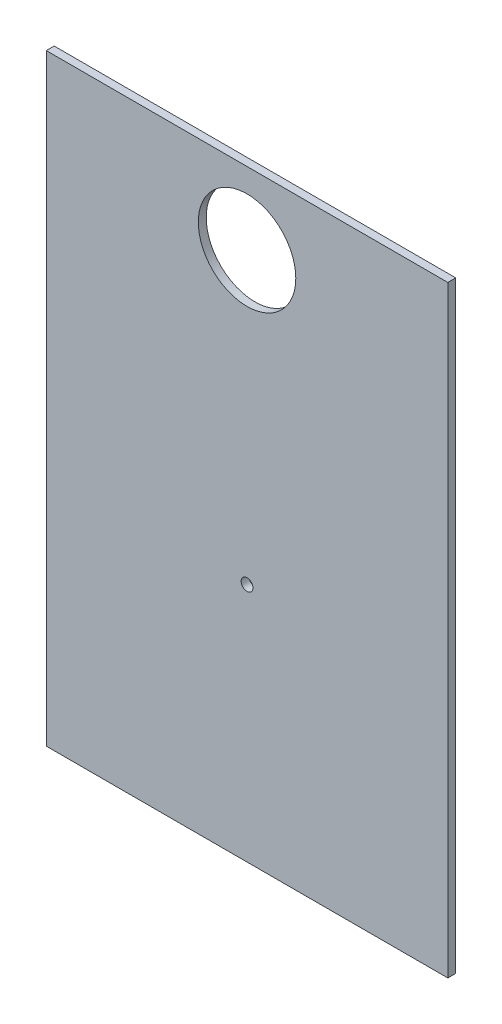
ISO-10303-21;
HEADER;
FILE_DESCRIPTION(('STEP AP214'),'2;1');
FILE_NAME('part.step','',(''),(''),'','','');
FILE_SCHEMA(('AUTOMOTIVE_DESIGN { 1 0 10303 214 1 1 1 1 }'));
ENDSEC;
DATA;
#1=APPLICATION_CONTEXT('core data for automotive mechanical design processes');
#2=APPLICATION_PROTOCOL_DEFINITION('international standard','automotive_design',2000,#1);
#3=PRODUCT_CONTEXT('',#1,'mechanical');
#4=PRODUCT('Part','Part','',(#3));
#5=PRODUCT_RELATED_PRODUCT_CATEGORY('part','',(#4));
#6=PRODUCT_DEFINITION_FORMATION('','',#4);
#7=PRODUCT_DEFINITION_CONTEXT('part definition',#1,'design');
#8=PRODUCT_DEFINITION('design','',#6,#7);
#9=PRODUCT_DEFINITION_SHAPE('','',#8);
#10=(LENGTH_UNIT() NAMED_UNIT(*) SI_UNIT(.MILLI.,.METRE.));
#11=(NAMED_UNIT(*) PLANE_ANGLE_UNIT() SI_UNIT($,.RADIAN.));
#12=(NAMED_UNIT(*) SI_UNIT($,.STERADIAN.) SOLID_ANGLE_UNIT());
#13=UNCERTAINTY_MEASURE_WITH_UNIT(LENGTH_MEASURE(1.E-05),#10,'distance_accuracy_value','');
#14=(GEOMETRIC_REPRESENTATION_CONTEXT(3) GLOBAL_UNCERTAINTY_ASSIGNED_CONTEXT((#13)) GLOBAL_UNIT_ASSIGNED_CONTEXT((#10,
#11,#12)) REPRESENTATION_CONTEXT('',''));
#15=CARTESIAN_POINT('',(0.,0.,0.));
#16=DIRECTION('',(0.,0.,1.));
#17=DIRECTION('',(1.,0.,0.));
#18=AXIS2_PLACEMENT_3D('',#15,#16,#17);
#19=CARTESIAN_POINT('',(-152.4,-228.6,6.));
#20=DIRECTION('',(1.,0.,0.));
#21=DIRECTION('',(0.,0.,-1.));
#22=AXIS2_PLACEMENT_3D('',#19,#20,#21);
#23=PLANE('',#22);
#24=DIRECTION('',(0.,-1.,0.));
#25=VECTOR('',#24,1.);
#26=CARTESIAN_POINT('',(-152.4,-228.6,0.));
#27=LINE('',#26,#25);
#28=CARTESIAN_POINT('',(-152.4,228.6,0.));
#29=VERTEX_POINT('',#28);
#30=CARTESIAN_POINT('',(-152.4,-228.6,0.));
#31=VERTEX_POINT('',#30);
#32=EDGE_CURVE('E95',#29,#31,#27,.T.);
#33=ORIENTED_EDGE('',*,*,#32,.T.);
#34=DIRECTION('',(0.,0.,-1.));
#35=VECTOR('',#34,1.);
#36=CARTESIAN_POINT('',(-152.4,-228.6,6.));
#37=LINE('',#36,#35);
#38=CARTESIAN_POINT('',(-152.4,-228.6,6.));
#39=VERTEX_POINT('',#38);
#40=EDGE_CURVE('E11',#39,#31,#37,.T.);
#41=ORIENTED_EDGE('',*,*,#40,.F.);
#42=DIRECTION('',(0.,-1.,0.));
#43=VECTOR('',#42,1.);
#44=CARTESIAN_POINT('',(-152.4,-228.6,6.));
#45=LINE('',#44,#43);
#46=CARTESIAN_POINT('',(-152.4,228.6,6.));
#47=VERTEX_POINT('',#46);
#48=EDGE_CURVE('E83',#47,#39,#45,.T.);
#49=ORIENTED_EDGE('',*,*,#48,.F.);
#50=DIRECTION('',(0.,0.,-1.));
#51=VECTOR('',#50,1.);
#52=CARTESIAN_POINT('',(-152.4,228.6,6.));
#53=LINE('',#52,#51);
#54=EDGE_CURVE('E91',#47,#29,#53,.T.);
#55=ORIENTED_EDGE('',*,*,#54,.T.);
#56=EDGE_LOOP('',(#33,#41,#49,#55));
#57=FACE_BOUND('',#56,.T.);
#58=ADVANCED_FACE('F32',(#57),#23,.F.);
#59=CARTESIAN_POINT('',(152.4,-228.6,6.));
#60=DIRECTION('',(0.,1.,0.));
#61=DIRECTION('',(0.,0.,1.));
#62=AXIS2_PLACEMENT_3D('',#59,#60,#61);
#63=PLANE('',#62);
#64=DIRECTION('',(1.,0.,0.));
#65=VECTOR('',#64,1.);
#66=CARTESIAN_POINT('',(152.4,-228.6,0.));
#67=LINE('',#66,#65);
#68=CARTESIAN_POINT('',(152.4,-228.6,0.));
#69=VERTEX_POINT('',#68);
#70=EDGE_CURVE('E87',#31,#69,#67,.T.);
#71=ORIENTED_EDGE('',*,*,#70,.T.);
#72=DIRECTION('',(0.,0.,-1.));
#73=VECTOR('',#72,1.);
#74=CARTESIAN_POINT('',(152.4,-228.6,6.));
#75=LINE('',#74,#73);
#76=CARTESIAN_POINT('',(152.4,-228.6,6.));
#77=VERTEX_POINT('',#76);
#78=EDGE_CURVE('E40',#77,#69,#75,.T.);
#79=ORIENTED_EDGE('',*,*,#78,.F.);
#80=DIRECTION('',(1.,0.,0.));
#81=VECTOR('',#80,1.);
#82=CARTESIAN_POINT('',(152.4,-228.6,6.));
#83=LINE('',#82,#81);
#84=EDGE_CURVE('E78',#39,#77,#83,.T.);
#85=ORIENTED_EDGE('',*,*,#84,.F.);
#86=ORIENTED_EDGE('',*,*,#40,.T.);
#87=EDGE_LOOP('',(#71,#79,#85,#86));
#88=FACE_BOUND('',#87,.T.);
#89=ADVANCED_FACE('F86',(#88),#63,.F.);
#90=CARTESIAN_POINT('',(152.4,-228.6,6.));
#91=DIRECTION('',(-1.,0.,0.));
#92=DIRECTION('',(0.,0.,1.));
#93=AXIS2_PLACEMENT_3D('',#90,#91,#92);
#94=PLANE('',#93);
#95=DIRECTION('',(0.,1.,0.));
#96=VECTOR('',#95,1.);
#97=CARTESIAN_POINT('',(152.4,-228.6,0.));
#98=LINE('',#97,#96);
#99=CARTESIAN_POINT('',(152.4,228.6,0.));
#100=VERTEX_POINT('',#99);
#101=EDGE_CURVE('E65',#69,#100,#98,.T.);
#102=ORIENTED_EDGE('',*,*,#101,.T.);
#103=DIRECTION('',(0.,0.,-1.));
#104=VECTOR('',#103,1.);
#105=CARTESIAN_POINT('',(152.4,228.6,6.));
#106=LINE('',#105,#104);
#107=CARTESIAN_POINT('',(152.4,228.6,6.));
#108=VERTEX_POINT('',#107);
#109=EDGE_CURVE('E88',#108,#100,#106,.T.);
#110=ORIENTED_EDGE('',*,*,#109,.F.);
#111=DIRECTION('',(0.,1.,0.));
#112=VECTOR('',#111,1.);
#113=CARTESIAN_POINT('',(152.4,-228.6,6.));
#114=LINE('',#113,#112);
#115=EDGE_CURVE('E81',#77,#108,#114,.T.);
#116=ORIENTED_EDGE('',*,*,#115,.F.);
#117=ORIENTED_EDGE('',*,*,#78,.T.);
#118=EDGE_LOOP('',(#102,#110,#116,#117));
#119=FACE_BOUND('',#118,.T.);
#120=ADVANCED_FACE('F89',(#119),#94,.F.);
#121=CARTESIAN_POINT('',(152.4,228.6,6.));
#122=DIRECTION('',(0.,-1.,0.));
#123=DIRECTION('',(0.,0.,-1.));
#124=AXIS2_PLACEMENT_3D('',#121,#122,#123);
#125=PLANE('',#124);
#126=DIRECTION('',(-1.,0.,0.));
#127=VECTOR('',#126,1.);
#128=CARTESIAN_POINT('',(152.4,228.6,0.));
#129=LINE('',#128,#127);
#130=EDGE_CURVE('E71',#100,#29,#129,.T.);
#131=ORIENTED_EDGE('',*,*,#130,.T.);
#132=ORIENTED_EDGE('',*,*,#54,.F.);
#133=DIRECTION('',(-1.,0.,0.));
#134=VECTOR('',#133,1.);
#135=CARTESIAN_POINT('',(152.4,228.6,6.));
#136=LINE('',#135,#134);
#137=EDGE_CURVE('E48',#108,#47,#136,.T.);
#138=ORIENTED_EDGE('',*,*,#137,.F.);
#139=ORIENTED_EDGE('',*,*,#109,.T.);
#140=EDGE_LOOP('',(#131,#132,#138,#139));
#141=FACE_BOUND('',#140,.T.);
#142=ADVANCED_FACE('F103',(#141),#125,.F.);
#143=CARTESIAN_POINT('',(0.,0.,6.));
#144=DIRECTION('',(0.,0.,1.));
#145=DIRECTION('',(1.,0.,0.));
#146=AXIS2_PLACEMENT_3D('',#143,#144,#145);
#147=PLANE('',#146);
#148=CARTESIAN_POINT('',(0.,-46.2000000000001,6.));
#149=DIRECTION('',(0.,0.,1.));
#150=DIRECTION('',(1.,0.,0.));
#151=AXIS2_PLACEMENT_3D('',#148,#149,#150);
#152=CIRCLE('',#151,4.5);
#153=CARTESIAN_POINT('',(4.49999999999995,-46.2000000000001,6.));
#154=VERTEX_POINT('',#153);
#155=EDGE_CURVE('E115',#154,#154,#152,.T.);
#156=ORIENTED_EDGE('',*,*,#155,.F.);
#157=EDGE_LOOP('',(#156));
#158=FACE_BOUND('',#157,.T.);
#159=CARTESIAN_POINT('',(0.,173.6,6.));
#160=DIRECTION('',(0.,0.,1.));
#161=DIRECTION('',(1.,0.,0.));
#162=AXIS2_PLACEMENT_3D('',#159,#160,#161);
#163=CIRCLE('',#162,37.);
#164=CARTESIAN_POINT('',(37.,173.6,6.));
#165=VERTEX_POINT('',#164);
#166=EDGE_CURVE('E109',#165,#165,#163,.T.);
#167=ORIENTED_EDGE('',*,*,#166,.F.);
#168=EDGE_LOOP('',(#167));
#169=FACE_BOUND('',#168,.T.);
#170=ORIENTED_EDGE('',*,*,#48,.T.);
#171=ORIENTED_EDGE('',*,*,#84,.T.);
#172=ORIENTED_EDGE('',*,*,#115,.T.);
#173=ORIENTED_EDGE('',*,*,#137,.T.);
#174=EDGE_LOOP('',(#170,#171,#172,#173));
#175=FACE_BOUND('',#174,.T.);
#176=ADVANCED_FACE('F79',(#158,#169,#175),#147,.T.);
#177=CARTESIAN_POINT('',(0.,0.,0.));
#178=DIRECTION('',(0.,0.,1.));
#179=DIRECTION('',(1.,0.,0.));
#180=AXIS2_PLACEMENT_3D('',#177,#178,#179);
#181=PLANE('',#180);
#182=CARTESIAN_POINT('',(0.,-46.2000000000001,0.));
#183=DIRECTION('',(0.,0.,1.));
#184=DIRECTION('',(1.,0.,0.));
#185=AXIS2_PLACEMENT_3D('',#182,#183,#184);
#186=CIRCLE('',#185,4.5);
#187=CARTESIAN_POINT('',(4.49999999999995,-46.2000000000001,0.));
#188=VERTEX_POINT('',#187);
#189=EDGE_CURVE('E112',#188,#188,#186,.T.);
#190=ORIENTED_EDGE('',*,*,#189,.T.);
#191=EDGE_LOOP('',(#190));
#192=FACE_BOUND('',#191,.T.);
#193=CARTESIAN_POINT('',(0.,173.6,0.));
#194=DIRECTION('',(0.,0.,1.));
#195=DIRECTION('',(1.,0.,0.));
#196=AXIS2_PLACEMENT_3D('',#193,#194,#195);
#197=CIRCLE('',#196,37.);
#198=CARTESIAN_POINT('',(37.,173.6,0.));
#199=VERTEX_POINT('',#198);
#200=EDGE_CURVE('E98',#199,#199,#197,.T.);
#201=ORIENTED_EDGE('',*,*,#200,.T.);
#202=EDGE_LOOP('',(#201));
#203=FACE_BOUND('',#202,.T.);
#204=ORIENTED_EDGE('',*,*,#32,.F.);
#205=ORIENTED_EDGE('',*,*,#130,.F.);
#206=ORIENTED_EDGE('',*,*,#101,.F.);
#207=ORIENTED_EDGE('',*,*,#70,.F.);
#208=EDGE_LOOP('',(#204,#205,#206,#207));
#209=FACE_BOUND('',#208,.T.);
#210=ADVANCED_FACE('F106',(#192,#203,#209),#181,.F.);
#211=CARTESIAN_POINT('',(0.,173.6,0.));
#212=DIRECTION('',(0.,0.,1.));
#213=DIRECTION('',(1.,0.,0.));
#214=AXIS2_PLACEMENT_3D('',#211,#212,#213);
#215=CYLINDRICAL_SURFACE('',#214,37.);
#216=ORIENTED_EDGE('',*,*,#200,.F.);
#217=EDGE_LOOP('',(#216));
#218=FACE_BOUND('',#217,.T.);
#219=ORIENTED_EDGE('',*,*,#166,.T.);
#220=EDGE_LOOP('',(#219));
#221=FACE_BOUND('',#220,.T.);
#222=ADVANCED_FACE('F126',(#218,#221),#215,.F.);
#223=CARTESIAN_POINT('',(0.,-46.2000000000001,0.));
#224=DIRECTION('',(0.,0.,1.));
#225=DIRECTION('',(1.,0.,0.));
#226=AXIS2_PLACEMENT_3D('',#223,#224,#225);
#227=CYLINDRICAL_SURFACE('',#226,4.5);
#228=ORIENTED_EDGE('',*,*,#189,.F.);
#229=EDGE_LOOP('',(#228));
#230=FACE_BOUND('',#229,.T.);
#231=ORIENTED_EDGE('',*,*,#155,.T.);
#232=EDGE_LOOP('',(#231));
#233=FACE_BOUND('',#232,.T.);
#234=ADVANCED_FACE('F123',(#230,#233),#227,.F.);
#235=CLOSED_SHELL('',(#58,#89,#120,#142,#176,#210,#222,#234));
#236=MANIFOLD_SOLID_BREP('B2',#235);
#237=ADVANCED_BREP_SHAPE_REPRESENTATION('',(#18,#236),#14);
#238=SHAPE_DEFINITION_REPRESENTATION(#9,#237);
ENDSEC;
END-ISO-10303-21;
